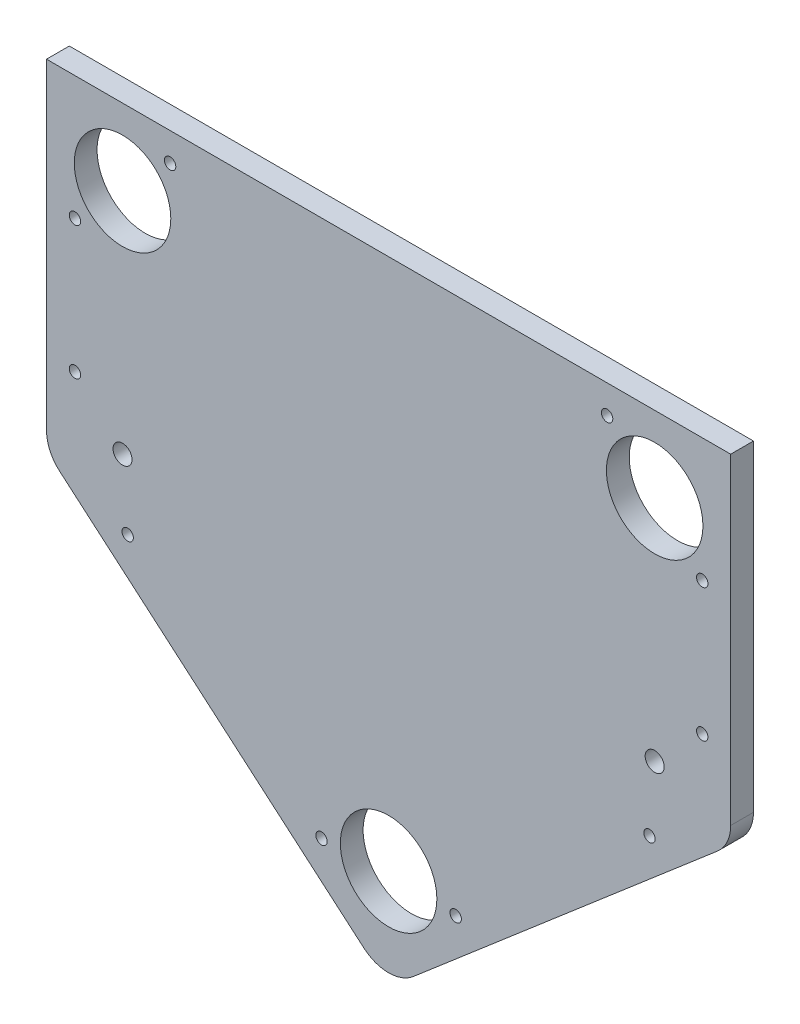
ISO-10303-21;
HEADER;
FILE_DESCRIPTION(('STEP AP214'),'2;1');
FILE_NAME('part.step','',(''),(''),'','','');
FILE_SCHEMA(('AUTOMOTIVE_DESIGN { 1 0 10303 214 1 1 1 1 }'));
ENDSEC;
DATA;
#1=APPLICATION_CONTEXT('core data for automotive mechanical design processes');
#2=APPLICATION_PROTOCOL_DEFINITION('international standard','automotive_design',2000,#1);
#3=PRODUCT_CONTEXT('',#1,'mechanical');
#4=PRODUCT('Part','Part','',(#3));
#5=PRODUCT_RELATED_PRODUCT_CATEGORY('part','',(#4));
#6=PRODUCT_DEFINITION_FORMATION('','',#4);
#7=PRODUCT_DEFINITION_CONTEXT('part definition',#1,'design');
#8=PRODUCT_DEFINITION('design','',#6,#7);
#9=PRODUCT_DEFINITION_SHAPE('','',#8);
#10=(LENGTH_UNIT() NAMED_UNIT(*) SI_UNIT(.MILLI.,.METRE.));
#11=(NAMED_UNIT(*) PLANE_ANGLE_UNIT() SI_UNIT($,.RADIAN.));
#12=(NAMED_UNIT(*) SI_UNIT($,.STERADIAN.) SOLID_ANGLE_UNIT());
#13=UNCERTAINTY_MEASURE_WITH_UNIT(LENGTH_MEASURE(1.E-05),#10,'distance_accuracy_value','');
#14=(GEOMETRIC_REPRESENTATION_CONTEXT(3) GLOBAL_UNCERTAINTY_ASSIGNED_CONTEXT((#13)) GLOBAL_UNIT_ASSIGNED_CONTEXT((#10,
#11,#12)) REPRESENTATION_CONTEXT('',''));
#15=CARTESIAN_POINT('',(0.,0.,0.));
#16=DIRECTION('',(0.,0.,1.));
#17=DIRECTION('',(1.,0.,0.));
#18=AXIS2_PLACEMENT_3D('',#15,#16,#17);
#19=CARTESIAN_POINT('',(0.,0.,6.));
#20=DIRECTION('',(0.,0.,-1.));
#21=DIRECTION('',(-1.,0.,0.));
#22=AXIS2_PLACEMENT_3D('',#19,#20,#21);
#23=PLANE('',#22);
#24=DIRECTION('',(0.,-1.,0.));
#25=VECTOR('',#24,1.);
#26=CARTESIAN_POINT('',(-90.,-9.19869844940825,6.));
#27=LINE('',#26,#25);
#28=CARTESIAN_POINT('',(-90.,80.,6.));
#29=VERTEX_POINT('',#28);
#30=CARTESIAN_POINT('',(-90.,-4.59934922470412,6.));
#31=VERTEX_POINT('',#30);
#32=EDGE_CURVE('E147',#29,#31,#27,.T.);
#33=ORIENTED_EDGE('',*,*,#32,.T.);
#34=CARTESIAN_POINT('',(-80.,-4.59934922470412,6.));
#35=DIRECTION('',(0.,0.,-1.));
#36=DIRECTION('',(-1.,0.,0.));
#37=AXIS2_PLACEMENT_3D('',#34,#35,#36);
#38=CIRCLE('',#37,10.);
#39=CARTESIAN_POINT('',(-86.5079137345597,-12.1919152483571,6.));
#40=VERTEX_POINT('',#39);
#41=EDGE_CURVE('E164',#31,#40,#38,.F.);
#42=ORIENTED_EDGE('',*,*,#41,.T.);
#43=DIRECTION('',(0.759256602365297,-0.650791373455968,0.));
#44=VECTOR('',#43,1.);
#45=CARTESIAN_POINT('',(0.,-86.3415555922654,6.));
#46=LINE('',#45,#44);
#47=CARTESIAN_POINT('',(-6.50791373455969,-80.7633438197857,6.));
#48=VERTEX_POINT('',#47);
#49=EDGE_CURVE('E221',#40,#48,#46,.T.);
#50=ORIENTED_EDGE('',*,*,#49,.T.);
#51=CARTESIAN_POINT('',(0.,-73.1707777961327,6.));
#52=DIRECTION('',(0.,0.,-1.));
#53=DIRECTION('',(-1.,0.,0.));
#54=AXIS2_PLACEMENT_3D('',#51,#52,#53);
#55=CIRCLE('',#54,10.);
#56=CARTESIAN_POINT('',(6.50791373455967,-80.7633438197857,6.));
#57=VERTEX_POINT('',#56);
#58=EDGE_CURVE('E161',#48,#57,#55,.F.);
#59=ORIENTED_EDGE('',*,*,#58,.T.);
#60=DIRECTION('',(0.759256602365297,0.650791373455969,0.));
#61=VECTOR('',#60,1.);
#62=CARTESIAN_POINT('',(90.,-9.19869844940823,6.));
#63=LINE('',#62,#61);
#64=CARTESIAN_POINT('',(86.5079137345597,-12.1919152483571,6.));
#65=VERTEX_POINT('',#64);
#66=EDGE_CURVE('E117',#57,#65,#63,.T.);
#67=ORIENTED_EDGE('',*,*,#66,.T.);
#68=CARTESIAN_POINT('',(80.,-4.59934922470409,6.));
#69=DIRECTION('',(0.,0.,-1.));
#70=DIRECTION('',(-1.,0.,0.));
#71=AXIS2_PLACEMENT_3D('',#68,#69,#70);
#72=CIRCLE('',#71,10.);
#73=CARTESIAN_POINT('',(90.,-4.59934922470409,6.));
#74=VERTEX_POINT('',#73);
#75=EDGE_CURVE('E60',#65,#74,#72,.F.);
#76=ORIENTED_EDGE('',*,*,#75,.T.);
#77=DIRECTION('',(0.,1.,0.));
#78=VECTOR('',#77,1.);
#79=CARTESIAN_POINT('',(90.,80.,6.));
#80=LINE('',#79,#78);
#81=CARTESIAN_POINT('',(90.,80.,6.));
#82=VERTEX_POINT('',#81);
#83=EDGE_CURVE('E107',#74,#82,#80,.T.);
#84=ORIENTED_EDGE('',*,*,#83,.T.);
#85=DIRECTION('',(-1.,0.,0.));
#86=VECTOR('',#85,1.);
#87=CARTESIAN_POINT('',(-90.,80.,6.));
#88=LINE('',#87,#86);
#89=EDGE_CURVE('E112',#82,#29,#88,.T.);
#90=ORIENTED_EDGE('',*,*,#89,.T.);
#91=EDGE_LOOP('',(#33,#42,#50,#59,#67,#76,#84,#90));
#92=FACE_BOUND('',#91,.T.);
#93=CARTESIAN_POINT('',(-70.,60.,6.));
#94=DIRECTION('',(0.,0.,1.));
#95=DIRECTION('',(1.,0.,0.));
#96=AXIS2_PLACEMENT_3D('',#93,#94,#95);
#97=CIRCLE('',#96,12.7);
#98=CARTESIAN_POINT('',(-57.3,60.,6.));
#99=VERTEX_POINT('',#98);
#100=EDGE_CURVE('E140',#99,#99,#97,.T.);
#101=ORIENTED_EDGE('',*,*,#100,.F.);
#102=EDGE_LOOP('',(#101));
#103=FACE_BOUND('',#102,.T.);
#104=CARTESIAN_POINT('',(70.,60.,6.));
#105=DIRECTION('',(0.,0.,1.));
#106=DIRECTION('',(1.,0.,0.));
#107=AXIS2_PLACEMENT_3D('',#104,#105,#106);
#108=CIRCLE('',#107,12.7);
#109=CARTESIAN_POINT('',(82.7,60.,6.));
#110=VERTEX_POINT('',#109);
#111=EDGE_CURVE('E229',#110,#110,#108,.T.);
#112=ORIENTED_EDGE('',*,*,#111,.F.);
#113=EDGE_LOOP('',(#112));
#114=FACE_BOUND('',#113,.T.);
#115=CARTESIAN_POINT('',(-70.,0.,6.));
#116=DIRECTION('',(0.,0.,1.));
#117=DIRECTION('',(1.,0.,0.));
#118=AXIS2_PLACEMENT_3D('',#115,#116,#117);
#119=CIRCLE('',#118,2.50000000000001);
#120=CARTESIAN_POINT('',(-67.5,0.,6.));
#121=VERTEX_POINT('',#120);
#122=EDGE_CURVE('E235',#121,#121,#119,.T.);
#123=ORIENTED_EDGE('',*,*,#122,.F.);
#124=EDGE_LOOP('',(#123));
#125=FACE_BOUND('',#124,.T.);
#126=CARTESIAN_POINT('',(70.,0.,6.));
#127=DIRECTION('',(0.,0.,1.));
#128=DIRECTION('',(1.,0.,0.));
#129=AXIS2_PLACEMENT_3D('',#126,#127,#128);
#130=CIRCLE('',#129,2.50000000000001);
#131=CARTESIAN_POINT('',(72.5,0.,6.));
#132=VERTEX_POINT('',#131);
#133=EDGE_CURVE('E241',#132,#132,#130,.T.);
#134=ORIENTED_EDGE('',*,*,#133,.F.);
#135=EDGE_LOOP('',(#134));
#136=FACE_BOUND('',#135,.T.);
#137=CARTESIAN_POINT('',(0.,-60.,6.));
#138=DIRECTION('',(0.,0.,1.));
#139=DIRECTION('',(1.,0.,0.));
#140=AXIS2_PLACEMENT_3D('',#137,#138,#139);
#141=CIRCLE('',#140,12.7);
#142=CARTESIAN_POINT('',(12.7,-60.,6.));
#143=VERTEX_POINT('',#142);
#144=EDGE_CURVE('E247',#143,#143,#141,.T.);
#145=ORIENTED_EDGE('',*,*,#144,.F.);
#146=EDGE_LOOP('',(#145));
#147=FACE_BOUND('',#146,.T.);
#148=CARTESIAN_POINT('',(-57.4842099729981,72.5157900270019,6.));
#149=DIRECTION('',(0.,0.,1.));
#150=DIRECTION('',(1.,0.,0.));
#151=AXIS2_PLACEMENT_3D('',#148,#149,#150);
#152=CIRCLE('',#151,1.5);
#153=CARTESIAN_POINT('',(-55.9842099729981,72.5157900270019,6.));
#154=VERTEX_POINT('',#153);
#155=EDGE_CURVE('E253',#154,#154,#152,.T.);
#156=ORIENTED_EDGE('',*,*,#155,.F.);
#157=EDGE_LOOP('',(#156));
#158=FACE_BOUND('',#157,.T.);
#159=CARTESIAN_POINT('',(-82.5157900270019,47.4842099729981,6.));
#160=DIRECTION('',(0.,0.,1.));
#161=DIRECTION('',(1.,0.,0.));
#162=AXIS2_PLACEMENT_3D('',#159,#160,#161);
#163=CIRCLE('',#162,1.5);
#164=CARTESIAN_POINT('',(-81.0157900270019,47.4842099729981,6.));
#165=VERTEX_POINT('',#164);
#166=EDGE_CURVE('E259',#165,#165,#163,.T.);
#167=ORIENTED_EDGE('',*,*,#166,.F.);
#168=EDGE_LOOP('',(#167));
#169=FACE_BOUND('',#168,.T.);
#170=CARTESIAN_POINT('',(-82.5157900270019,12.5157900270019,6.));
#171=DIRECTION('',(0.,0.,1.));
#172=DIRECTION('',(1.,0.,0.));
#173=AXIS2_PLACEMENT_3D('',#170,#171,#172);
#174=CIRCLE('',#173,1.5);
#175=CARTESIAN_POINT('',(-81.0157900270019,12.5157900270019,6.));
#176=VERTEX_POINT('',#175);
#177=EDGE_CURVE('E265',#176,#176,#174,.T.);
#178=ORIENTED_EDGE('',*,*,#177,.F.);
#179=EDGE_LOOP('',(#178));
#180=FACE_BOUND('',#179,.T.);
#181=CARTESIAN_POINT('',(-68.6424719697402,-17.647864393378,6.));
#182=DIRECTION('',(0.,0.,1.));
#183=DIRECTION('',(1.,0.,0.));
#184=AXIS2_PLACEMENT_3D('',#181,#182,#183);
#185=CIRCLE('',#184,1.5);
#186=CARTESIAN_POINT('',(-67.1424719697402,-17.647864393378,6.));
#187=VERTEX_POINT('',#186);
#188=EDGE_CURVE('E271',#187,#187,#185,.T.);
#189=ORIENTED_EDGE('',*,*,#188,.F.);
#190=EDGE_LOOP('',(#189));
#191=FACE_BOUND('',#190,.T.);
#192=CARTESIAN_POINT('',(-17.647864393378,-61.3575280302599,6.));
#193=DIRECTION('',(0.,0.,1.));
#194=DIRECTION('',(1.,0.,0.));
#195=AXIS2_PLACEMENT_3D('',#192,#193,#194);
#196=CIRCLE('',#195,1.5);
#197=CARTESIAN_POINT('',(-16.147864393378,-61.3575280302599,6.));
#198=VERTEX_POINT('',#197);
#199=EDGE_CURVE('E277',#198,#198,#196,.T.);
#200=ORIENTED_EDGE('',*,*,#199,.F.);
#201=EDGE_LOOP('',(#200));
#202=FACE_BOUND('',#201,.T.);
#203=CARTESIAN_POINT('',(17.647864393378,-61.3575280302599,6.));
#204=DIRECTION('',(0.,0.,1.));
#205=DIRECTION('',(-1.,0.,0.));
#206=AXIS2_PLACEMENT_3D('',#203,#204,#205);
#207=CIRCLE('',#206,1.5);
#208=CARTESIAN_POINT('',(16.147864393378,-61.3575280302599,6.));
#209=VERTEX_POINT('',#208);
#210=EDGE_CURVE('E283',#209,#209,#207,.T.);
#211=ORIENTED_EDGE('',*,*,#210,.F.);
#212=EDGE_LOOP('',(#211));
#213=FACE_BOUND('',#212,.T.);
#214=CARTESIAN_POINT('',(68.6424719697402,-17.647864393378,6.));
#215=DIRECTION('',(0.,0.,1.));
#216=DIRECTION('',(-1.,0.,0.));
#217=AXIS2_PLACEMENT_3D('',#214,#215,#216);
#218=CIRCLE('',#217,1.5);
#219=CARTESIAN_POINT('',(67.1424719697402,-17.647864393378,6.));
#220=VERTEX_POINT('',#219);
#221=EDGE_CURVE('E289',#220,#220,#218,.T.);
#222=ORIENTED_EDGE('',*,*,#221,.F.);
#223=EDGE_LOOP('',(#222));
#224=FACE_BOUND('',#223,.T.);
#225=CARTESIAN_POINT('',(82.5157900270019,12.5157900270019,6.));
#226=DIRECTION('',(0.,0.,1.));
#227=DIRECTION('',(-1.,0.,0.));
#228=AXIS2_PLACEMENT_3D('',#225,#226,#227);
#229=CIRCLE('',#228,1.5);
#230=CARTESIAN_POINT('',(81.0157900270019,12.5157900270019,6.));
#231=VERTEX_POINT('',#230);
#232=EDGE_CURVE('E295',#231,#231,#229,.T.);
#233=ORIENTED_EDGE('',*,*,#232,.F.);
#234=EDGE_LOOP('',(#233));
#235=FACE_BOUND('',#234,.T.);
#236=CARTESIAN_POINT('',(82.5157900270019,47.4842099729981,6.));
#237=DIRECTION('',(0.,0.,1.));
#238=DIRECTION('',(-1.,0.,0.));
#239=AXIS2_PLACEMENT_3D('',#236,#237,#238);
#240=CIRCLE('',#239,1.5);
#241=CARTESIAN_POINT('',(81.0157900270019,47.4842099729981,6.));
#242=VERTEX_POINT('',#241);
#243=EDGE_CURVE('E301',#242,#242,#240,.T.);
#244=ORIENTED_EDGE('',*,*,#243,.F.);
#245=EDGE_LOOP('',(#244));
#246=FACE_BOUND('',#245,.T.);
#247=CARTESIAN_POINT('',(57.4842099729981,72.5157900270019,6.));
#248=DIRECTION('',(0.,0.,1.));
#249=DIRECTION('',(-1.,0.,0.));
#250=AXIS2_PLACEMENT_3D('',#247,#248,#249);
#251=CIRCLE('',#250,1.5);
#252=CARTESIAN_POINT('',(55.9842099729981,72.5157900270019,6.));
#253=VERTEX_POINT('',#252);
#254=EDGE_CURVE('E307',#253,#253,#251,.T.);
#255=ORIENTED_EDGE('',*,*,#254,.F.);
#256=EDGE_LOOP('',(#255));
#257=FACE_BOUND('',#256,.T.);
#258=ADVANCED_FACE('F45',(#92,#103,#114,#125,#136,#147,#158,#169,#180,#191,#202,#213,#224,#235,
#246,#257),#23,.F.);
#259=CARTESIAN_POINT('',(0.,0.,0.));
#260=DIRECTION('',(0.,0.,-1.));
#261=DIRECTION('',(-1.,0.,0.));
#262=AXIS2_PLACEMENT_3D('',#259,#260,#261);
#263=PLANE('',#262);
#264=CARTESIAN_POINT('',(82.5157900270019,47.4842099729981,0.));
#265=DIRECTION('',(0.,0.,1.));
#266=DIRECTION('',(-1.,0.,0.));
#267=AXIS2_PLACEMENT_3D('',#264,#265,#266);
#268=CIRCLE('',#267,1.5);
#269=CARTESIAN_POINT('',(81.0157900270019,47.4842099729981,0.));
#270=VERTEX_POINT('',#269);
#271=EDGE_CURVE('E304',#270,#270,#268,.T.);
#272=ORIENTED_EDGE('',*,*,#271,.T.);
#273=EDGE_LOOP('',(#272));
#274=FACE_BOUND('',#273,.T.);
#275=CARTESIAN_POINT('',(68.6424719697402,-17.647864393378,0.));
#276=DIRECTION('',(0.,0.,1.));
#277=DIRECTION('',(-1.,0.,0.));
#278=AXIS2_PLACEMENT_3D('',#275,#276,#277);
#279=CIRCLE('',#278,1.5);
#280=CARTESIAN_POINT('',(67.1424719697402,-17.647864393378,0.));
#281=VERTEX_POINT('',#280);
#282=EDGE_CURVE('E292',#281,#281,#279,.T.);
#283=ORIENTED_EDGE('',*,*,#282,.T.);
#284=EDGE_LOOP('',(#283));
#285=FACE_BOUND('',#284,.T.);
#286=CARTESIAN_POINT('',(-17.647864393378,-61.3575280302599,0.));
#287=DIRECTION('',(0.,0.,1.));
#288=DIRECTION('',(1.,0.,0.));
#289=AXIS2_PLACEMENT_3D('',#286,#287,#288);
#290=CIRCLE('',#289,1.5);
#291=CARTESIAN_POINT('',(-16.147864393378,-61.3575280302599,0.));
#292=VERTEX_POINT('',#291);
#293=EDGE_CURVE('E280',#292,#292,#290,.T.);
#294=ORIENTED_EDGE('',*,*,#293,.T.);
#295=EDGE_LOOP('',(#294));
#296=FACE_BOUND('',#295,.T.);
#297=CARTESIAN_POINT('',(-82.5157900270019,12.5157900270019,0.));
#298=DIRECTION('',(0.,0.,1.));
#299=DIRECTION('',(1.,0.,0.));
#300=AXIS2_PLACEMENT_3D('',#297,#298,#299);
#301=CIRCLE('',#300,1.5);
#302=CARTESIAN_POINT('',(-81.0157900270019,12.5157900270019,0.));
#303=VERTEX_POINT('',#302);
#304=EDGE_CURVE('E268',#303,#303,#301,.T.);
#305=ORIENTED_EDGE('',*,*,#304,.T.);
#306=EDGE_LOOP('',(#305));
#307=FACE_BOUND('',#306,.T.);
#308=CARTESIAN_POINT('',(-57.4842099729981,72.5157900270019,0.));
#309=DIRECTION('',(0.,0.,1.));
#310=DIRECTION('',(1.,0.,0.));
#311=AXIS2_PLACEMENT_3D('',#308,#309,#310);
#312=CIRCLE('',#311,1.5);
#313=CARTESIAN_POINT('',(-55.9842099729981,72.5157900270019,0.));
#314=VERTEX_POINT('',#313);
#315=EDGE_CURVE('E256',#314,#314,#312,.T.);
#316=ORIENTED_EDGE('',*,*,#315,.T.);
#317=EDGE_LOOP('',(#316));
#318=FACE_BOUND('',#317,.T.);
#319=CARTESIAN_POINT('',(70.,0.,0.));
#320=DIRECTION('',(0.,0.,1.));
#321=DIRECTION('',(1.,0.,0.));
#322=AXIS2_PLACEMENT_3D('',#319,#320,#321);
#323=CIRCLE('',#322,2.50000000000001);
#324=CARTESIAN_POINT('',(72.5,0.,0.));
#325=VERTEX_POINT('',#324);
#326=EDGE_CURVE('E244',#325,#325,#323,.T.);
#327=ORIENTED_EDGE('',*,*,#326,.T.);
#328=EDGE_LOOP('',(#327));
#329=FACE_BOUND('',#328,.T.);
#330=CARTESIAN_POINT('',(70.,60.,0.));
#331=DIRECTION('',(0.,0.,1.));
#332=DIRECTION('',(1.,0.,0.));
#333=AXIS2_PLACEMENT_3D('',#330,#331,#332);
#334=CIRCLE('',#333,12.7);
#335=CARTESIAN_POINT('',(82.7,60.,0.));
#336=VERTEX_POINT('',#335);
#337=EDGE_CURVE('E232',#336,#336,#334,.T.);
#338=ORIENTED_EDGE('',*,*,#337,.T.);
#339=EDGE_LOOP('',(#338));
#340=FACE_BOUND('',#339,.T.);
#341=DIRECTION('',(0.759256602365297,-0.650791373455968,0.));
#342=VECTOR('',#341,1.);
#343=CARTESIAN_POINT('',(0.,-86.3415555922654,0.));
#344=LINE('',#343,#342);
#345=CARTESIAN_POINT('',(-86.5079137345597,-12.1919152483571,0.));
#346=VERTEX_POINT('',#345);
#347=CARTESIAN_POINT('',(-6.50791373455969,-80.7633438197857,0.));
#348=VERTEX_POINT('',#347);
#349=EDGE_CURVE('E139',#346,#348,#344,.T.);
#350=ORIENTED_EDGE('',*,*,#349,.F.);
#351=CARTESIAN_POINT('',(-80.,-4.59934922470412,0.));
#352=DIRECTION('',(0.,0.,-1.));
#353=DIRECTION('',(-1.,0.,0.));
#354=AXIS2_PLACEMENT_3D('',#351,#352,#353);
#355=CIRCLE('',#354,10.);
#356=CARTESIAN_POINT('',(-90.,-4.59934922470412,0.));
#357=VERTEX_POINT('',#356);
#358=EDGE_CURVE('E157',#346,#357,#355,.T.);
#359=ORIENTED_EDGE('',*,*,#358,.T.);
#360=DIRECTION('',(0.,-1.,0.));
#361=VECTOR('',#360,1.);
#362=CARTESIAN_POINT('',(-90.,-9.19869844940825,0.));
#363=LINE('',#362,#361);
#364=CARTESIAN_POINT('',(-90.,80.,0.));
#365=VERTEX_POINT('',#364);
#366=EDGE_CURVE('E136',#365,#357,#363,.T.);
#367=ORIENTED_EDGE('',*,*,#366,.F.);
#368=DIRECTION('',(-1.,0.,0.));
#369=VECTOR('',#368,1.);
#370=CARTESIAN_POINT('',(-90.,80.,0.));
#371=LINE('',#370,#369);
#372=CARTESIAN_POINT('',(90.,80.,0.));
#373=VERTEX_POINT('',#372);
#374=EDGE_CURVE('E146',#373,#365,#371,.T.);
#375=ORIENTED_EDGE('',*,*,#374,.F.);
#376=DIRECTION('',(0.,1.,0.));
#377=VECTOR('',#376,1.);
#378=CARTESIAN_POINT('',(90.,80.,0.));
#379=LINE('',#378,#377);
#380=CARTESIAN_POINT('',(90.,-4.59934922470409,0.));
#381=VERTEX_POINT('',#380);
#382=EDGE_CURVE('E123',#381,#373,#379,.T.);
#383=ORIENTED_EDGE('',*,*,#382,.F.);
#384=CARTESIAN_POINT('',(80.,-4.59934922470409,0.));
#385=DIRECTION('',(0.,0.,-1.));
#386=DIRECTION('',(-1.,0.,0.));
#387=AXIS2_PLACEMENT_3D('',#384,#385,#386);
#388=CIRCLE('',#387,10.);
#389=CARTESIAN_POINT('',(86.5079137345597,-12.1919152483571,0.));
#390=VERTEX_POINT('',#389);
#391=EDGE_CURVE('E155',#381,#390,#388,.T.);
#392=ORIENTED_EDGE('',*,*,#391,.T.);
#393=DIRECTION('',(0.759256602365297,0.650791373455969,0.));
#394=VECTOR('',#393,1.);
#395=CARTESIAN_POINT('',(90.,-9.19869844940823,0.));
#396=LINE('',#395,#394);
#397=CARTESIAN_POINT('',(6.50791373455967,-80.7633438197857,0.));
#398=VERTEX_POINT('',#397);
#399=EDGE_CURVE('E143',#398,#390,#396,.T.);
#400=ORIENTED_EDGE('',*,*,#399,.F.);
#401=CARTESIAN_POINT('',(0.,-73.1707777961327,0.));
#402=DIRECTION('',(0.,0.,-1.));
#403=DIRECTION('',(-1.,0.,0.));
#404=AXIS2_PLACEMENT_3D('',#401,#402,#403);
#405=CIRCLE('',#404,10.);
#406=EDGE_CURVE('E153',#398,#348,#405,.T.);
#407=ORIENTED_EDGE('',*,*,#406,.T.);
#408=EDGE_LOOP('',(#350,#359,#367,#375,#383,#392,#400,#407));
#409=FACE_BOUND('',#408,.T.);
#410=CARTESIAN_POINT('',(-70.,60.,0.));
#411=DIRECTION('',(0.,0.,1.));
#412=DIRECTION('',(1.,0.,0.));
#413=AXIS2_PLACEMENT_3D('',#410,#411,#412);
#414=CIRCLE('',#413,12.7);
#415=CARTESIAN_POINT('',(-57.3,60.,0.));
#416=VERTEX_POINT('',#415);
#417=EDGE_CURVE('E226',#416,#416,#414,.T.);
#418=ORIENTED_EDGE('',*,*,#417,.T.);
#419=EDGE_LOOP('',(#418));
#420=FACE_BOUND('',#419,.T.);
#421=CARTESIAN_POINT('',(-70.,0.,0.));
#422=DIRECTION('',(0.,0.,1.));
#423=DIRECTION('',(1.,0.,0.));
#424=AXIS2_PLACEMENT_3D('',#421,#422,#423);
#425=CIRCLE('',#424,2.50000000000001);
#426=CARTESIAN_POINT('',(-67.5,0.,0.));
#427=VERTEX_POINT('',#426);
#428=EDGE_CURVE('E238',#427,#427,#425,.T.);
#429=ORIENTED_EDGE('',*,*,#428,.T.);
#430=EDGE_LOOP('',(#429));
#431=FACE_BOUND('',#430,.T.);
#432=CARTESIAN_POINT('',(0.,-60.,0.));
#433=DIRECTION('',(0.,0.,1.));
#434=DIRECTION('',(1.,0.,0.));
#435=AXIS2_PLACEMENT_3D('',#432,#433,#434);
#436=CIRCLE('',#435,12.7);
#437=CARTESIAN_POINT('',(12.7,-60.,0.));
#438=VERTEX_POINT('',#437);
#439=EDGE_CURVE('E250',#438,#438,#436,.T.);
#440=ORIENTED_EDGE('',*,*,#439,.T.);
#441=EDGE_LOOP('',(#440));
#442=FACE_BOUND('',#441,.T.);
#443=CARTESIAN_POINT('',(-82.5157900270019,47.4842099729981,0.));
#444=DIRECTION('',(0.,0.,1.));
#445=DIRECTION('',(1.,0.,0.));
#446=AXIS2_PLACEMENT_3D('',#443,#444,#445);
#447=CIRCLE('',#446,1.5);
#448=CARTESIAN_POINT('',(-81.0157900270019,47.4842099729981,0.));
#449=VERTEX_POINT('',#448);
#450=EDGE_CURVE('E262',#449,#449,#447,.T.);
#451=ORIENTED_EDGE('',*,*,#450,.T.);
#452=EDGE_LOOP('',(#451));
#453=FACE_BOUND('',#452,.T.);
#454=CARTESIAN_POINT('',(-68.6424719697402,-17.647864393378,0.));
#455=DIRECTION('',(0.,0.,1.));
#456=DIRECTION('',(1.,0.,0.));
#457=AXIS2_PLACEMENT_3D('',#454,#455,#456);
#458=CIRCLE('',#457,1.5);
#459=CARTESIAN_POINT('',(-67.1424719697402,-17.647864393378,0.));
#460=VERTEX_POINT('',#459);
#461=EDGE_CURVE('E274',#460,#460,#458,.T.);
#462=ORIENTED_EDGE('',*,*,#461,.T.);
#463=EDGE_LOOP('',(#462));
#464=FACE_BOUND('',#463,.T.);
#465=CARTESIAN_POINT('',(17.647864393378,-61.3575280302599,0.));
#466=DIRECTION('',(0.,0.,1.));
#467=DIRECTION('',(-1.,0.,0.));
#468=AXIS2_PLACEMENT_3D('',#465,#466,#467);
#469=CIRCLE('',#468,1.5);
#470=CARTESIAN_POINT('',(16.147864393378,-61.3575280302599,0.));
#471=VERTEX_POINT('',#470);
#472=EDGE_CURVE('E286',#471,#471,#469,.T.);
#473=ORIENTED_EDGE('',*,*,#472,.T.);
#474=EDGE_LOOP('',(#473));
#475=FACE_BOUND('',#474,.T.);
#476=CARTESIAN_POINT('',(82.5157900270019,12.5157900270019,0.));
#477=DIRECTION('',(0.,0.,1.));
#478=DIRECTION('',(-1.,0.,0.));
#479=AXIS2_PLACEMENT_3D('',#476,#477,#478);
#480=CIRCLE('',#479,1.5);
#481=CARTESIAN_POINT('',(81.0157900270019,12.5157900270019,0.));
#482=VERTEX_POINT('',#481);
#483=EDGE_CURVE('E298',#482,#482,#480,.T.);
#484=ORIENTED_EDGE('',*,*,#483,.T.);
#485=EDGE_LOOP('',(#484));
#486=FACE_BOUND('',#485,.T.);
#487=CARTESIAN_POINT('',(57.4842099729981,72.5157900270019,0.));
#488=DIRECTION('',(0.,0.,1.));
#489=DIRECTION('',(-1.,0.,0.));
#490=AXIS2_PLACEMENT_3D('',#487,#488,#489);
#491=CIRCLE('',#490,1.5);
#492=CARTESIAN_POINT('',(55.9842099729981,72.5157900270019,0.));
#493=VERTEX_POINT('',#492);
#494=EDGE_CURVE('E310',#493,#493,#491,.T.);
#495=ORIENTED_EDGE('',*,*,#494,.T.);
#496=EDGE_LOOP('',(#495));
#497=FACE_BOUND('',#496,.T.);
#498=ADVANCED_FACE('F175',(#274,#285,#296,#307,#318,#329,#340,#409,#420,#431,#442,#453,#464,
#475,#486,#497),#263,.T.);
#499=CARTESIAN_POINT('',(-90.,-9.19869844940825,6.));
#500=DIRECTION('',(1.,0.,0.));
#501=DIRECTION('',(0.,0.,-1.));
#502=AXIS2_PLACEMENT_3D('',#499,#500,#501);
#503=PLANE('',#502);
#504=ORIENTED_EDGE('',*,*,#366,.T.);
#505=DIRECTION('',(0.,0.,-1.));
#506=VECTOR('',#505,1.);
#507=CARTESIAN_POINT('',(-90.,-4.59934922470412,6.));
#508=LINE('',#507,#506);
#509=EDGE_CURVE('E159',#357,#31,#508,.F.);
#510=ORIENTED_EDGE('',*,*,#509,.T.);
#511=ORIENTED_EDGE('',*,*,#32,.F.);
#512=DIRECTION('',(0.,0.,-1.));
#513=VECTOR('',#512,1.);
#514=CARTESIAN_POINT('',(-90.,80.,6.));
#515=LINE('',#514,#513);
#516=EDGE_CURVE('E127',#29,#365,#515,.T.);
#517=ORIENTED_EDGE('',*,*,#516,.T.);
#518=EDGE_LOOP('',(#504,#510,#511,#517));
#519=FACE_BOUND('',#518,.T.);
#520=ADVANCED_FACE('F194',(#519),#503,.F.);
#521=CARTESIAN_POINT('',(0.,-86.3415555922654,6.));
#522=DIRECTION('',(0.650791373455968,0.759256602365297,0.));
#523=DIRECTION('',(-0.759256602365297,0.650791373455968,0.));
#524=AXIS2_PLACEMENT_3D('',#521,#522,#523);
#525=PLANE('',#524);
#526=ORIENTED_EDGE('',*,*,#49,.F.);
#527=DIRECTION('',(0.,0.,-1.));
#528=VECTOR('',#527,1.);
#529=CARTESIAN_POINT('',(-86.5079137345597,-12.1919152483571,6.));
#530=LINE('',#529,#528);
#531=EDGE_CURVE('E150',#40,#346,#530,.T.);
#532=ORIENTED_EDGE('',*,*,#531,.T.);
#533=ORIENTED_EDGE('',*,*,#349,.T.);
#534=DIRECTION('',(0.,0.,-1.));
#535=VECTOR('',#534,1.);
#536=CARTESIAN_POINT('',(-6.50791373455969,-80.7633438197857,6.));
#537=LINE('',#536,#535);
#538=EDGE_CURVE('E126',#348,#48,#537,.F.);
#539=ORIENTED_EDGE('',*,*,#538,.T.);
#540=EDGE_LOOP('',(#526,#532,#533,#539));
#541=FACE_BOUND('',#540,.T.);
#542=ADVANCED_FACE('F207',(#541),#525,.F.);
#543=CARTESIAN_POINT('',(90.,-9.19869844940823,6.));
#544=DIRECTION('',(-0.650791373455968,0.759256602365296,0.));
#545=DIRECTION('',(-0.759256602365297,-0.650791373455968,0.));
#546=AXIS2_PLACEMENT_3D('',#543,#544,#545);
#547=PLANE('',#546);
#548=ORIENTED_EDGE('',*,*,#399,.T.);
#549=DIRECTION('',(0.,0.,-1.));
#550=VECTOR('',#549,1.);
#551=CARTESIAN_POINT('',(86.5079137345597,-12.1919152483571,6.));
#552=LINE('',#551,#550);
#553=EDGE_CURVE('E11',#390,#65,#552,.F.);
#554=ORIENTED_EDGE('',*,*,#553,.T.);
#555=ORIENTED_EDGE('',*,*,#66,.F.);
#556=DIRECTION('',(0.,0.,-1.));
#557=VECTOR('',#556,1.);
#558=CARTESIAN_POINT('',(6.50791373455965,-80.7633438197857,6.));
#559=LINE('',#558,#557);
#560=EDGE_CURVE('E53',#57,#398,#559,.T.);
#561=ORIENTED_EDGE('',*,*,#560,.T.);
#562=EDGE_LOOP('',(#548,#554,#555,#561));
#563=FACE_BOUND('',#562,.T.);
#564=ADVANCED_FACE('F170',(#563),#547,.F.);
#565=CARTESIAN_POINT('',(90.,80.,6.));
#566=DIRECTION('',(-1.,0.,0.));
#567=DIRECTION('',(0.,0.,1.));
#568=AXIS2_PLACEMENT_3D('',#565,#566,#567);
#569=PLANE('',#568);
#570=ORIENTED_EDGE('',*,*,#83,.F.);
#571=DIRECTION('',(0.,0.,-1.));
#572=VECTOR('',#571,1.);
#573=CARTESIAN_POINT('',(90.,-4.59934922470409,6.));
#574=LINE('',#573,#572);
#575=EDGE_CURVE('E166',#74,#381,#574,.T.);
#576=ORIENTED_EDGE('',*,*,#575,.T.);
#577=ORIENTED_EDGE('',*,*,#382,.T.);
#578=DIRECTION('',(0.,0.,-1.));
#579=VECTOR('',#578,1.);
#580=CARTESIAN_POINT('',(90.,80.,6.));
#581=LINE('',#580,#579);
#582=EDGE_CURVE('E120',#82,#373,#581,.T.);
#583=ORIENTED_EDGE('',*,*,#582,.F.);
#584=EDGE_LOOP('',(#570,#576,#577,#583));
#585=FACE_BOUND('',#584,.T.);
#586=ADVANCED_FACE('F121',(#585),#569,.F.);
#587=CARTESIAN_POINT('',(-90.,80.,6.));
#588=DIRECTION('',(0.,-1.,0.));
#589=DIRECTION('',(0.,0.,-1.));
#590=AXIS2_PLACEMENT_3D('',#587,#588,#589);
#591=PLANE('',#590);
#592=ORIENTED_EDGE('',*,*,#374,.T.);
#593=ORIENTED_EDGE('',*,*,#516,.F.);
#594=ORIENTED_EDGE('',*,*,#89,.F.);
#595=ORIENTED_EDGE('',*,*,#582,.T.);
#596=EDGE_LOOP('',(#592,#593,#594,#595));
#597=FACE_BOUND('',#596,.T.);
#598=ADVANCED_FACE('F129',(#597),#591,.F.);
#599=CARTESIAN_POINT('',(-70.,60.,6.));
#600=DIRECTION('',(0.,0.,-1.));
#601=DIRECTION('',(-1.,0.,0.));
#602=AXIS2_PLACEMENT_3D('',#599,#600,#601);
#603=CYLINDRICAL_SURFACE('',#602,12.7);
#604=ORIENTED_EDGE('',*,*,#100,.T.);
#605=EDGE_LOOP('',(#604));
#606=FACE_BOUND('',#605,.T.);
#607=ORIENTED_EDGE('',*,*,#417,.F.);
#608=EDGE_LOOP('',(#607));
#609=FACE_BOUND('',#608,.T.);
#610=ADVANCED_FACE('F198',(#606,#609),#603,.F.);
#611=CARTESIAN_POINT('',(70.,60.,6.));
#612=DIRECTION('',(0.,0.,-1.));
#613=DIRECTION('',(-1.,0.,0.));
#614=AXIS2_PLACEMENT_3D('',#611,#612,#613);
#615=CYLINDRICAL_SURFACE('',#614,12.7);
#616=ORIENTED_EDGE('',*,*,#111,.T.);
#617=EDGE_LOOP('',(#616));
#618=FACE_BOUND('',#617,.T.);
#619=ORIENTED_EDGE('',*,*,#337,.F.);
#620=EDGE_LOOP('',(#619));
#621=FACE_BOUND('',#620,.T.);
#622=ADVANCED_FACE('F370',(#618,#621),#615,.F.);
#623=CARTESIAN_POINT('',(-70.,0.,6.));
#624=DIRECTION('',(0.,0.,-1.));
#625=DIRECTION('',(-1.,0.,0.));
#626=AXIS2_PLACEMENT_3D('',#623,#624,#625);
#627=CYLINDRICAL_SURFACE('',#626,2.50000000000001);
#628=ORIENTED_EDGE('',*,*,#122,.T.);
#629=EDGE_LOOP('',(#628));
#630=FACE_BOUND('',#629,.T.);
#631=ORIENTED_EDGE('',*,*,#428,.F.);
#632=EDGE_LOOP('',(#631));
#633=FACE_BOUND('',#632,.T.);
#634=ADVANCED_FACE('F367',(#630,#633),#627,.F.);
#635=CARTESIAN_POINT('',(70.,0.,6.));
#636=DIRECTION('',(0.,0.,-1.));
#637=DIRECTION('',(-1.,0.,0.));
#638=AXIS2_PLACEMENT_3D('',#635,#636,#637);
#639=CYLINDRICAL_SURFACE('',#638,2.50000000000001);
#640=ORIENTED_EDGE('',*,*,#133,.T.);
#641=EDGE_LOOP('',(#640));
#642=FACE_BOUND('',#641,.T.);
#643=ORIENTED_EDGE('',*,*,#326,.F.);
#644=EDGE_LOOP('',(#643));
#645=FACE_BOUND('',#644,.T.);
#646=ADVANCED_FACE('F363',(#642,#645),#639,.F.);
#647=CARTESIAN_POINT('',(0.,-60.,6.));
#648=DIRECTION('',(0.,0.,-1.));
#649=DIRECTION('',(-1.,0.,0.));
#650=AXIS2_PLACEMENT_3D('',#647,#648,#649);
#651=CYLINDRICAL_SURFACE('',#650,12.7);
#652=ORIENTED_EDGE('',*,*,#144,.T.);
#653=EDGE_LOOP('',(#652));
#654=FACE_BOUND('',#653,.T.);
#655=ORIENTED_EDGE('',*,*,#439,.F.);
#656=EDGE_LOOP('',(#655));
#657=FACE_BOUND('',#656,.T.);
#658=ADVANCED_FACE('F359',(#654,#657),#651,.F.);
#659=CARTESIAN_POINT('',(-57.4842099729981,72.5157900270019,6.));
#660=DIRECTION('',(0.,0.,-1.));
#661=DIRECTION('',(-1.,0.,0.));
#662=AXIS2_PLACEMENT_3D('',#659,#660,#661);
#663=CYLINDRICAL_SURFACE('',#662,1.5);
#664=ORIENTED_EDGE('',*,*,#155,.T.);
#665=EDGE_LOOP('',(#664));
#666=FACE_BOUND('',#665,.T.);
#667=ORIENTED_EDGE('',*,*,#315,.F.);
#668=EDGE_LOOP('',(#667));
#669=FACE_BOUND('',#668,.T.);
#670=ADVANCED_FACE('F355',(#666,#669),#663,.F.);
#671=CARTESIAN_POINT('',(-82.5157900270019,47.4842099729981,6.));
#672=DIRECTION('',(0.,0.,-1.));
#673=DIRECTION('',(-1.,0.,0.));
#674=AXIS2_PLACEMENT_3D('',#671,#672,#673);
#675=CYLINDRICAL_SURFACE('',#674,1.5);
#676=ORIENTED_EDGE('',*,*,#166,.T.);
#677=EDGE_LOOP('',(#676));
#678=FACE_BOUND('',#677,.T.);
#679=ORIENTED_EDGE('',*,*,#450,.F.);
#680=EDGE_LOOP('',(#679));
#681=FACE_BOUND('',#680,.T.);
#682=ADVANCED_FACE('F351',(#678,#681),#675,.F.);
#683=CARTESIAN_POINT('',(-82.5157900270019,12.5157900270019,6.));
#684=DIRECTION('',(0.,0.,-1.));
#685=DIRECTION('',(-1.,0.,0.));
#686=AXIS2_PLACEMENT_3D('',#683,#684,#685);
#687=CYLINDRICAL_SURFACE('',#686,1.5);
#688=ORIENTED_EDGE('',*,*,#177,.T.);
#689=EDGE_LOOP('',(#688));
#690=FACE_BOUND('',#689,.T.);
#691=ORIENTED_EDGE('',*,*,#304,.F.);
#692=EDGE_LOOP('',(#691));
#693=FACE_BOUND('',#692,.T.);
#694=ADVANCED_FACE('F347',(#690,#693),#687,.F.);
#695=CARTESIAN_POINT('',(-68.6424719697402,-17.647864393378,6.));
#696=DIRECTION('',(0.,0.,-1.));
#697=DIRECTION('',(-1.,0.,0.));
#698=AXIS2_PLACEMENT_3D('',#695,#696,#697);
#699=CYLINDRICAL_SURFACE('',#698,1.5);
#700=ORIENTED_EDGE('',*,*,#188,.T.);
#701=EDGE_LOOP('',(#700));
#702=FACE_BOUND('',#701,.T.);
#703=ORIENTED_EDGE('',*,*,#461,.F.);
#704=EDGE_LOOP('',(#703));
#705=FACE_BOUND('',#704,.T.);
#706=ADVANCED_FACE('F343',(#702,#705),#699,.F.);
#707=CARTESIAN_POINT('',(-17.647864393378,-61.3575280302599,6.));
#708=DIRECTION('',(0.,0.,-1.));
#709=DIRECTION('',(-1.,0.,0.));
#710=AXIS2_PLACEMENT_3D('',#707,#708,#709);
#711=CYLINDRICAL_SURFACE('',#710,1.5);
#712=ORIENTED_EDGE('',*,*,#199,.T.);
#713=EDGE_LOOP('',(#712));
#714=FACE_BOUND('',#713,.T.);
#715=ORIENTED_EDGE('',*,*,#293,.F.);
#716=EDGE_LOOP('',(#715));
#717=FACE_BOUND('',#716,.T.);
#718=ADVANCED_FACE('F339',(#714,#717),#711,.F.);
#719=CARTESIAN_POINT('',(17.647864393378,-61.3575280302599,6.));
#720=DIRECTION('',(0.,0.,-1.));
#721=DIRECTION('',(-1.,0.,0.));
#722=AXIS2_PLACEMENT_3D('',#719,#720,#721);
#723=CYLINDRICAL_SURFACE('',#722,1.5);
#724=ORIENTED_EDGE('',*,*,#210,.T.);
#725=EDGE_LOOP('',(#724));
#726=FACE_BOUND('',#725,.T.);
#727=ORIENTED_EDGE('',*,*,#472,.F.);
#728=EDGE_LOOP('',(#727));
#729=FACE_BOUND('',#728,.T.);
#730=ADVANCED_FACE('F335',(#726,#729),#723,.F.);
#731=CARTESIAN_POINT('',(68.6424719697402,-17.647864393378,6.));
#732=DIRECTION('',(0.,0.,-1.));
#733=DIRECTION('',(-1.,0.,0.));
#734=AXIS2_PLACEMENT_3D('',#731,#732,#733);
#735=CYLINDRICAL_SURFACE('',#734,1.5);
#736=ORIENTED_EDGE('',*,*,#221,.T.);
#737=EDGE_LOOP('',(#736));
#738=FACE_BOUND('',#737,.T.);
#739=ORIENTED_EDGE('',*,*,#282,.F.);
#740=EDGE_LOOP('',(#739));
#741=FACE_BOUND('',#740,.T.);
#742=ADVANCED_FACE('F331',(#738,#741),#735,.F.);
#743=CARTESIAN_POINT('',(82.5157900270019,12.5157900270019,6.));
#744=DIRECTION('',(0.,0.,-1.));
#745=DIRECTION('',(-1.,0.,0.));
#746=AXIS2_PLACEMENT_3D('',#743,#744,#745);
#747=CYLINDRICAL_SURFACE('',#746,1.5);
#748=ORIENTED_EDGE('',*,*,#232,.T.);
#749=EDGE_LOOP('',(#748));
#750=FACE_BOUND('',#749,.T.);
#751=ORIENTED_EDGE('',*,*,#483,.F.);
#752=EDGE_LOOP('',(#751));
#753=FACE_BOUND('',#752,.T.);
#754=ADVANCED_FACE('F325',(#750,#753),#747,.F.);
#755=CARTESIAN_POINT('',(82.5157900270019,47.4842099729981,6.));
#756=DIRECTION('',(0.,0.,-1.));
#757=DIRECTION('',(-1.,0.,0.));
#758=AXIS2_PLACEMENT_3D('',#755,#756,#757);
#759=CYLINDRICAL_SURFACE('',#758,1.5);
#760=ORIENTED_EDGE('',*,*,#243,.T.);
#761=EDGE_LOOP('',(#760));
#762=FACE_BOUND('',#761,.T.);
#763=ORIENTED_EDGE('',*,*,#271,.F.);
#764=EDGE_LOOP('',(#763));
#765=FACE_BOUND('',#764,.T.);
#766=ADVANCED_FACE('F318',(#762,#765),#759,.F.);
#767=CARTESIAN_POINT('',(57.4842099729981,72.5157900270019,6.));
#768=DIRECTION('',(0.,0.,-1.));
#769=DIRECTION('',(-1.,0.,0.));
#770=AXIS2_PLACEMENT_3D('',#767,#768,#769);
#771=CYLINDRICAL_SURFACE('',#770,1.5);
#772=ORIENTED_EDGE('',*,*,#254,.T.);
#773=EDGE_LOOP('',(#772));
#774=FACE_BOUND('',#773,.T.);
#775=ORIENTED_EDGE('',*,*,#494,.F.);
#776=EDGE_LOOP('',(#775));
#777=FACE_BOUND('',#776,.T.);
#778=ADVANCED_FACE('F185',(#774,#777),#771,.F.);
#779=CARTESIAN_POINT('',(-80.,-4.59934922470412,6.));
#780=DIRECTION('',(0.,0.,-1.));
#781=DIRECTION('',(-1.,0.,0.));
#782=AXIS2_PLACEMENT_3D('',#779,#780,#781);
#783=CYLINDRICAL_SURFACE('',#782,10.);
#784=ORIENTED_EDGE('',*,*,#41,.F.);
#785=ORIENTED_EDGE('',*,*,#509,.F.);
#786=ORIENTED_EDGE('',*,*,#358,.F.);
#787=ORIENTED_EDGE('',*,*,#531,.F.);
#788=EDGE_LOOP('',(#784,#785,#786,#787));
#789=FACE_BOUND('',#788,.T.);
#790=ADVANCED_FACE('F180',(#789),#783,.T.);
#791=CARTESIAN_POINT('',(80.,-4.59934922470409,6.));
#792=DIRECTION('',(0.,0.,-1.));
#793=DIRECTION('',(-1.,0.,0.));
#794=AXIS2_PLACEMENT_3D('',#791,#792,#793);
#795=CYLINDRICAL_SURFACE('',#794,10.);
#796=ORIENTED_EDGE('',*,*,#75,.F.);
#797=ORIENTED_EDGE('',*,*,#553,.F.);
#798=ORIENTED_EDGE('',*,*,#391,.F.);
#799=ORIENTED_EDGE('',*,*,#575,.F.);
#800=EDGE_LOOP('',(#796,#797,#798,#799));
#801=FACE_BOUND('',#800,.T.);
#802=ADVANCED_FACE('F178',(#801),#795,.T.);
#803=CARTESIAN_POINT('',(0.,-73.1707777961327,6.));
#804=DIRECTION('',(0.,0.,-1.));
#805=DIRECTION('',(-1.,0.,0.));
#806=AXIS2_PLACEMENT_3D('',#803,#804,#805);
#807=CYLINDRICAL_SURFACE('',#806,10.);
#808=ORIENTED_EDGE('',*,*,#58,.F.);
#809=ORIENTED_EDGE('',*,*,#538,.F.);
#810=ORIENTED_EDGE('',*,*,#406,.F.);
#811=ORIENTED_EDGE('',*,*,#560,.F.);
#812=EDGE_LOOP('',(#808,#809,#810,#811));
#813=FACE_BOUND('',#812,.T.);
#814=ADVANCED_FACE('F47',(#813),#807,.T.);
#815=CLOSED_SHELL('',(#258,#498,#520,#542,#564,#586,#598,#610,#622,#634,#646,#658,#670,#682,
#694,#706,#718,#730,#742,#754,#766,#778,#790,#802,#814));
#816=MANIFOLD_SOLID_BREP('B2',#815);
#817=ADVANCED_BREP_SHAPE_REPRESENTATION('',(#18,#816),#14);
#818=SHAPE_DEFINITION_REPRESENTATION(#9,#817);
ENDSEC;
END-ISO-10303-21;
